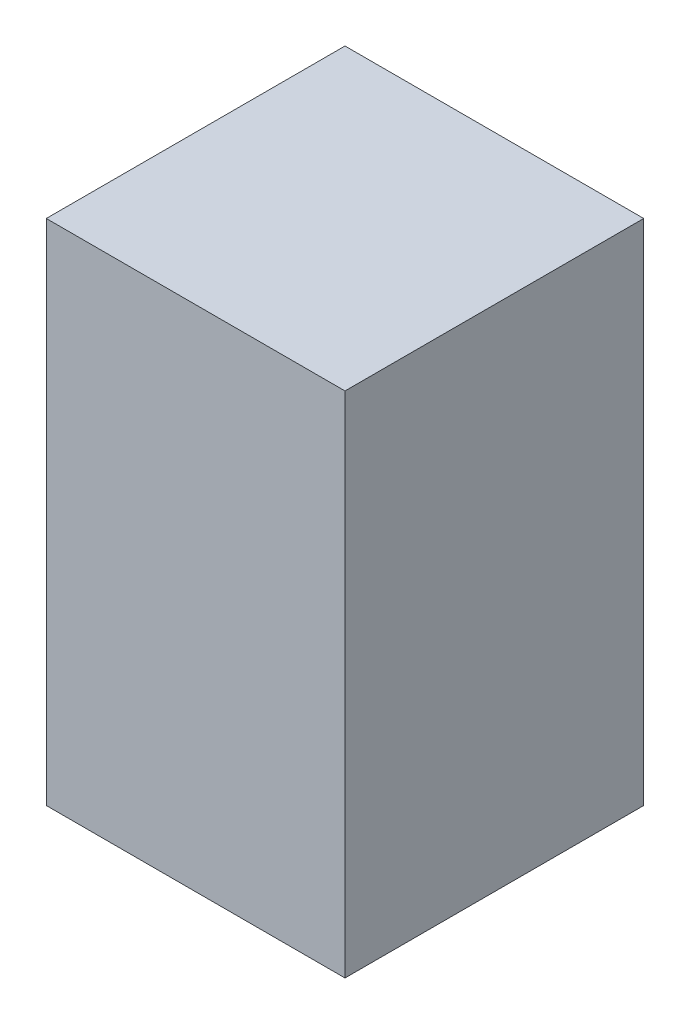
ISO-10303-21;
HEADER;
FILE_DESCRIPTION(('STEP AP214'),'2;1');
FILE_NAME('part.step','',(''),(''),'','','');
FILE_SCHEMA(('AUTOMOTIVE_DESIGN { 1 0 10303 214 1 1 1 1 }'));
ENDSEC;
DATA;
#1=APPLICATION_CONTEXT('core data for automotive mechanical design processes');
#2=APPLICATION_PROTOCOL_DEFINITION('international standard','automotive_design',2000,#1);
#3=PRODUCT_CONTEXT('',#1,'mechanical');
#4=PRODUCT('Part','Part','',(#3));
#5=PRODUCT_RELATED_PRODUCT_CATEGORY('part','',(#4));
#6=PRODUCT_DEFINITION_FORMATION('','',#4);
#7=PRODUCT_DEFINITION_CONTEXT('part definition',#1,'design');
#8=PRODUCT_DEFINITION('design','',#6,#7);
#9=PRODUCT_DEFINITION_SHAPE('','',#8);
#10=(LENGTH_UNIT() NAMED_UNIT(*) SI_UNIT(.MILLI.,.METRE.));
#11=(NAMED_UNIT(*) PLANE_ANGLE_UNIT() SI_UNIT($,.RADIAN.));
#12=(NAMED_UNIT(*) SI_UNIT($,.STERADIAN.) SOLID_ANGLE_UNIT());
#13=UNCERTAINTY_MEASURE_WITH_UNIT(LENGTH_MEASURE(1.E-05),#10,'distance_accuracy_value','');
#14=(GEOMETRIC_REPRESENTATION_CONTEXT(3) GLOBAL_UNCERTAINTY_ASSIGNED_CONTEXT((#13)) GLOBAL_UNIT_ASSIGNED_CONTEXT((#10,
#11,#12)) REPRESENTATION_CONTEXT('',''));
#15=CARTESIAN_POINT('',(0.,0.,0.));
#16=DIRECTION('',(0.,0.,1.));
#17=DIRECTION('',(1.,0.,0.));
#18=AXIS2_PLACEMENT_3D('',#15,#16,#17);
#19=CARTESIAN_POINT('',(50.,170.2,50.));
#20=DIRECTION('',(-1.,0.,0.));
#21=DIRECTION('',(0.,0.,1.));
#22=AXIS2_PLACEMENT_3D('',#19,#20,#21);
#23=PLANE('',#22);
#24=DIRECTION('',(0.,0.,-1.));
#25=VECTOR('',#24,1.);
#26=CARTESIAN_POINT('',(50.,0.,50.));
#27=LINE('',#26,#25);
#28=CARTESIAN_POINT('',(50.,0.,50.));
#29=VERTEX_POINT('',#28);
#30=CARTESIAN_POINT('',(50.,0.,-50.));
#31=VERTEX_POINT('',#30);
#32=EDGE_CURVE('E113',#29,#31,#27,.T.);
#33=ORIENTED_EDGE('',*,*,#32,.T.);
#34=DIRECTION('',(0.,-1.,0.));
#35=VECTOR('',#34,1.);
#36=CARTESIAN_POINT('',(50.,170.2,-50.));
#37=LINE('',#36,#35);
#38=CARTESIAN_POINT('',(50.,170.2,-50.));
#39=VERTEX_POINT('',#38);
#40=EDGE_CURVE('E11',#39,#31,#37,.T.);
#41=ORIENTED_EDGE('',*,*,#40,.F.);
#42=DIRECTION('',(0.,0.,-1.));
#43=VECTOR('',#42,1.);
#44=CARTESIAN_POINT('',(50.,170.2,50.));
#45=LINE('',#44,#43);
#46=CARTESIAN_POINT('',(50.,170.2,50.));
#47=VERTEX_POINT('',#46);
#48=EDGE_CURVE('E97',#47,#39,#45,.T.);
#49=ORIENTED_EDGE('',*,*,#48,.F.);
#50=DIRECTION('',(0.,-1.,0.));
#51=VECTOR('',#50,1.);
#52=CARTESIAN_POINT('',(50.,170.2,50.));
#53=LINE('',#52,#51);
#54=EDGE_CURVE('E109',#47,#29,#53,.T.);
#55=ORIENTED_EDGE('',*,*,#54,.T.);
#56=EDGE_LOOP('',(#33,#41,#49,#55));
#57=FACE_BOUND('',#56,.T.);
#58=ADVANCED_FACE('F45',(#57),#23,.F.);
#59=CARTESIAN_POINT('',(-50.,170.2,-50.));
#60=DIRECTION('',(0.,0.,1.));
#61=DIRECTION('',(1.,0.,0.));
#62=AXIS2_PLACEMENT_3D('',#59,#60,#61);
#63=PLANE('',#62);
#64=DIRECTION('',(-1.,0.,0.));
#65=VECTOR('',#64,1.);
#66=CARTESIAN_POINT('',(-50.,0.,-50.));
#67=LINE('',#66,#65);
#68=CARTESIAN_POINT('',(-50.,0.,-50.));
#69=VERTEX_POINT('',#68);
#70=EDGE_CURVE('E102',#31,#69,#67,.T.);
#71=ORIENTED_EDGE('',*,*,#70,.T.);
#72=DIRECTION('',(0.,-1.,0.));
#73=VECTOR('',#72,1.);
#74=CARTESIAN_POINT('',(-50.,170.2,-50.));
#75=LINE('',#74,#73);
#76=CARTESIAN_POINT('',(-50.,170.2,-50.));
#77=VERTEX_POINT('',#76);
#78=EDGE_CURVE('E54',#77,#69,#75,.T.);
#79=ORIENTED_EDGE('',*,*,#78,.F.);
#80=DIRECTION('',(-1.,0.,0.));
#81=VECTOR('',#80,1.);
#82=CARTESIAN_POINT('',(-50.,170.2,-50.));
#83=LINE('',#82,#81);
#84=EDGE_CURVE('E92',#39,#77,#83,.T.);
#85=ORIENTED_EDGE('',*,*,#84,.F.);
#86=ORIENTED_EDGE('',*,*,#40,.T.);
#87=EDGE_LOOP('',(#71,#79,#85,#86));
#88=FACE_BOUND('',#87,.T.);
#89=ADVANCED_FACE('F101',(#88),#63,.F.);
#90=CARTESIAN_POINT('',(-50.,170.2,50.));
#91=DIRECTION('',(1.,0.,0.));
#92=DIRECTION('',(0.,0.,-1.));
#93=AXIS2_PLACEMENT_3D('',#90,#91,#92);
#94=PLANE('',#93);
#95=DIRECTION('',(0.,0.,1.));
#96=VECTOR('',#95,1.);
#97=CARTESIAN_POINT('',(-50.,0.,50.));
#98=LINE('',#97,#96);
#99=CARTESIAN_POINT('',(-50.,0.,50.));
#100=VERTEX_POINT('',#99);
#101=EDGE_CURVE('E79',#69,#100,#98,.T.);
#102=ORIENTED_EDGE('',*,*,#101,.T.);
#103=DIRECTION('',(0.,-1.,0.));
#104=VECTOR('',#103,1.);
#105=CARTESIAN_POINT('',(-50.,170.2,50.));
#106=LINE('',#105,#104);
#107=CARTESIAN_POINT('',(-50.,170.2,50.));
#108=VERTEX_POINT('',#107);
#109=EDGE_CURVE('E104',#108,#100,#106,.T.);
#110=ORIENTED_EDGE('',*,*,#109,.F.);
#111=DIRECTION('',(0.,0.,1.));
#112=VECTOR('',#111,1.);
#113=CARTESIAN_POINT('',(-50.,170.2,50.));
#114=LINE('',#113,#112);
#115=EDGE_CURVE('E95',#77,#108,#114,.T.);
#116=ORIENTED_EDGE('',*,*,#115,.F.);
#117=ORIENTED_EDGE('',*,*,#78,.T.);
#118=EDGE_LOOP('',(#102,#110,#116,#117));
#119=FACE_BOUND('',#118,.T.);
#120=ADVANCED_FACE('F105',(#119),#94,.F.);
#121=CARTESIAN_POINT('',(-50.,170.2,50.));
#122=DIRECTION('',(0.,0.,-1.));
#123=DIRECTION('',(-1.,0.,0.));
#124=AXIS2_PLACEMENT_3D('',#121,#122,#123);
#125=PLANE('',#124);
#126=DIRECTION('',(1.,0.,0.));
#127=VECTOR('',#126,1.);
#128=CARTESIAN_POINT('',(-50.,0.,50.));
#129=LINE('',#128,#127);
#130=EDGE_CURVE('E85',#100,#29,#129,.T.);
#131=ORIENTED_EDGE('',*,*,#130,.T.);
#132=ORIENTED_EDGE('',*,*,#54,.F.);
#133=DIRECTION('',(1.,0.,0.));
#134=VECTOR('',#133,1.);
#135=CARTESIAN_POINT('',(-50.,170.2,50.));
#136=LINE('',#135,#134);
#137=EDGE_CURVE('E62',#108,#47,#136,.T.);
#138=ORIENTED_EDGE('',*,*,#137,.F.);
#139=ORIENTED_EDGE('',*,*,#109,.T.);
#140=EDGE_LOOP('',(#131,#132,#138,#139));
#141=FACE_BOUND('',#140,.T.);
#142=ADVANCED_FACE('F127',(#141),#125,.F.);
#143=CARTESIAN_POINT('',(0.,170.2,0.));
#144=DIRECTION('',(0.,-1.,0.));
#145=DIRECTION('',(0.,0.,-1.));
#146=AXIS2_PLACEMENT_3D('',#143,#144,#145);
#147=PLANE('',#146);
#148=ORIENTED_EDGE('',*,*,#48,.T.);
#149=ORIENTED_EDGE('',*,*,#84,.T.);
#150=ORIENTED_EDGE('',*,*,#115,.T.);
#151=ORIENTED_EDGE('',*,*,#137,.T.);
#152=EDGE_LOOP('',(#148,#149,#150,#151));
#153=FACE_BOUND('',#152,.T.);
#154=ADVANCED_FACE('F93',(#153),#147,.F.);
#155=CARTESIAN_POINT('',(0.,0.,0.));
#156=DIRECTION('',(0.,-1.,0.));
#157=DIRECTION('',(0.,0.,-1.));
#158=AXIS2_PLACEMENT_3D('',#155,#156,#157);
#159=PLANE('',#158);
#160=CARTESIAN_POINT('',(0.,0.,0.));
#161=DIRECTION('',(0.,-1.,0.));
#162=DIRECTION('',(0.,0.,-1.));
#163=AXIS2_PLACEMENT_3D('',#160,#161,#162);
#164=CIRCLE('',#163,38.6296560574691);
#165=CARTESIAN_POINT('',(0.,0.,-38.6296560574691));
#166=VERTEX_POINT('',#165);
#167=EDGE_CURVE('E134',#166,#166,#164,.T.);
#168=ORIENTED_EDGE('',*,*,#167,.F.);
#169=EDGE_LOOP('',(#168));
#170=FACE_BOUND('',#169,.T.);
#171=ORIENTED_EDGE('',*,*,#32,.F.);
#172=ORIENTED_EDGE('',*,*,#130,.F.);
#173=ORIENTED_EDGE('',*,*,#101,.F.);
#174=ORIENTED_EDGE('',*,*,#70,.F.);
#175=EDGE_LOOP('',(#171,#172,#173,#174));
#176=FACE_BOUND('',#175,.T.);
#177=ADVANCED_FACE('F130',(#170,#176),#159,.T.);
#178=CARTESIAN_POINT('',(0.,39.1999999999999,0.));
#179=DIRECTION('',(0.,-1.,0.));
#180=DIRECTION('',(0.,0.,-1.));
#181=AXIS2_PLACEMENT_3D('',#178,#179,#180);
#182=CYLINDRICAL_SURFACE('',#181,38.6296560574691);
#183=CARTESIAN_POINT('',(0.,39.1999999999999,0.));
#184=DIRECTION('',(0.,-1.,0.));
#185=DIRECTION('',(0.,0.,-1.));
#186=AXIS2_PLACEMENT_3D('',#183,#184,#185);
#187=CIRCLE('',#186,38.6296560574691);
#188=CARTESIAN_POINT('',(0.,39.1999999999999,-38.6296560574691));
#189=VERTEX_POINT('',#188);
#190=EDGE_CURVE('E117',#189,#189,#187,.T.);
#191=ORIENTED_EDGE('',*,*,#190,.F.);
#192=EDGE_LOOP('',(#191));
#193=FACE_BOUND('',#192,.T.);
#194=ORIENTED_EDGE('',*,*,#167,.T.);
#195=EDGE_LOOP('',(#194));
#196=FACE_BOUND('',#195,.T.);
#197=ADVANCED_FACE('F161',(#193,#196),#182,.F.);
#198=CARTESIAN_POINT('',(0.,39.1999999999999,0.));
#199=DIRECTION('',(0.,-1.,0.));
#200=DIRECTION('',(0.,0.,-1.));
#201=AXIS2_PLACEMENT_3D('',#198,#199,#200);
#202=PLANE('',#201);
#203=CARTESIAN_POINT('',(0.,39.1999999999999,0.));
#204=DIRECTION('',(0.,-1.,0.));
#205=DIRECTION('',(0.,0.,-1.));
#206=AXIS2_PLACEMENT_3D('',#203,#204,#205);
#207=CIRCLE('',#206,26.3667874597619);
#208=CARTESIAN_POINT('',(0.,39.1999999999999,-26.3667874597619));
#209=VERTEX_POINT('',#208);
#210=EDGE_CURVE('E142',#209,#209,#207,.T.);
#211=ORIENTED_EDGE('',*,*,#210,.F.);
#212=EDGE_LOOP('',(#211));
#213=FACE_BOUND('',#212,.T.);
#214=ORIENTED_EDGE('',*,*,#190,.T.);
#215=EDGE_LOOP('',(#214));
#216=FACE_BOUND('',#215,.T.);
#217=ADVANCED_FACE('F155',(#213,#216),#202,.T.);
#218=CARTESIAN_POINT('',(0.,0.,0.));
#219=DIRECTION('',(0.,1.,0.));
#220=DIRECTION('',(0.,0.,1.));
#221=AXIS2_PLACEMENT_3D('',#218,#219,#220);
#222=CYLINDRICAL_SURFACE('',#221,26.3667874597619);
#223=CARTESIAN_POINT('',(0.,0.,0.));
#224=DIRECTION('',(0.,-1.,0.));
#225=DIRECTION('',(0.,0.,-1.));
#226=AXIS2_PLACEMENT_3D('',#223,#224,#225);
#227=CIRCLE('',#226,26.3667874597619);
#228=CARTESIAN_POINT('',(0.,0.,-26.3667874597619));
#229=VERTEX_POINT('',#228);
#230=EDGE_CURVE('E138',#229,#229,#227,.T.);
#231=ORIENTED_EDGE('',*,*,#230,.F.);
#232=EDGE_LOOP('',(#231));
#233=FACE_BOUND('',#232,.T.);
#234=ORIENTED_EDGE('',*,*,#210,.T.);
#235=EDGE_LOOP('',(#234));
#236=FACE_BOUND('',#235,.T.);
#237=ADVANCED_FACE('F152',(#233,#236),#222,.T.);
#238=CARTESIAN_POINT('',(0.,0.,0.));
#239=DIRECTION('',(0.,-1.,0.));
#240=DIRECTION('',(0.,0.,-1.));
#241=AXIS2_PLACEMENT_3D('',#238,#239,#240);
#242=PLANE('',#241);
#243=ORIENTED_EDGE('',*,*,#230,.T.);
#244=EDGE_LOOP('',(#243));
#245=FACE_BOUND('',#244,.T.);
#246=ADVANCED_FACE('F150',(#245),#242,.T.);
#247=CLOSED_SHELL('',(#58,#89,#120,#142,#154,#177,#197,#217,#237,#246));
#248=MANIFOLD_SOLID_BREP('B2',#247);
#249=ADVANCED_BREP_SHAPE_REPRESENTATION('',(#18,#248),#14);
#250=SHAPE_DEFINITION_REPRESENTATION(#9,#249);
ENDSEC;
END-ISO-10303-21;
